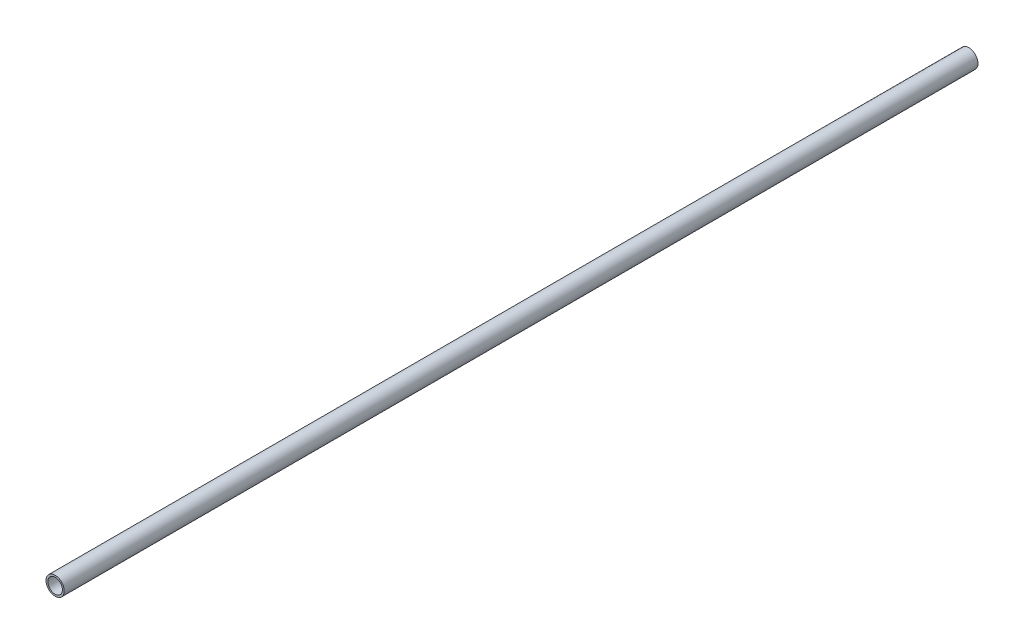
ISO-10303-21;
HEADER;
FILE_DESCRIPTION(('STEP AP214'),'2;1');
FILE_NAME('part.step','',(''),(''),'','','');
FILE_SCHEMA(('AUTOMOTIVE_DESIGN { 1 0 10303 214 1 1 1 1 }'));
ENDSEC;
DATA;
#1=APPLICATION_CONTEXT('core data for automotive mechanical design processes');
#2=APPLICATION_PROTOCOL_DEFINITION('international standard','automotive_design',2000,#1);
#3=PRODUCT_CONTEXT('',#1,'mechanical');
#4=PRODUCT('Part','Part','',(#3));
#5=PRODUCT_RELATED_PRODUCT_CATEGORY('part','',(#4));
#6=PRODUCT_DEFINITION_FORMATION('','',#4);
#7=PRODUCT_DEFINITION_CONTEXT('part definition',#1,'design');
#8=PRODUCT_DEFINITION('design','',#6,#7);
#9=PRODUCT_DEFINITION_SHAPE('','',#8);
#10=(LENGTH_UNIT() NAMED_UNIT(*) SI_UNIT(.MILLI.,.METRE.));
#11=(NAMED_UNIT(*) PLANE_ANGLE_UNIT() SI_UNIT($,.RADIAN.));
#12=(NAMED_UNIT(*) SI_UNIT($,.STERADIAN.) SOLID_ANGLE_UNIT());
#13=UNCERTAINTY_MEASURE_WITH_UNIT(LENGTH_MEASURE(1.E-05),#10,'distance_accuracy_value','');
#14=(GEOMETRIC_REPRESENTATION_CONTEXT(3) GLOBAL_UNCERTAINTY_ASSIGNED_CONTEXT((#13)) GLOBAL_UNIT_ASSIGNED_CONTEXT((#10,
#11,#12)) REPRESENTATION_CONTEXT('',''));
#15=CARTESIAN_POINT('',(0.,0.,0.));
#16=DIRECTION('',(0.,0.,1.));
#17=DIRECTION('',(1.,0.,0.));
#18=AXIS2_PLACEMENT_3D('',#15,#16,#17);
#19=CARTESIAN_POINT('',(0.,0.,1000.));
#20=DIRECTION('',(0.,0.,1.));
#21=DIRECTION('',(1.,0.,0.));
#22=AXIS2_PLACEMENT_3D('',#19,#20,#21);
#23=PLANE('',#22);
#24=CARTESIAN_POINT('',(0.,0.,1000.));
#25=DIRECTION('',(0.,0.,1.));
#26=DIRECTION('',(1.,0.,0.));
#27=AXIS2_PLACEMENT_3D('',#24,#25,#26);
#28=CIRCLE('',#27,10.);
#29=CARTESIAN_POINT('',(10.,0.,1000.));
#30=VERTEX_POINT('',#29);
#31=EDGE_CURVE('E10',#30,#30,#28,.T.);
#32=ORIENTED_EDGE('',*,*,#31,.T.);
#33=EDGE_LOOP('',(#32));
#34=FACE_BOUND('',#33,.T.);
#35=CARTESIAN_POINT('',(0.,0.,1000.));
#36=DIRECTION('',(0.,0.,1.));
#37=DIRECTION('',(1.,0.,0.));
#38=AXIS2_PLACEMENT_3D('',#35,#36,#37);
#39=CIRCLE('',#38,8.);
#40=CARTESIAN_POINT('',(8.,0.,1000.));
#41=VERTEX_POINT('',#40);
#42=EDGE_CURVE('E41',#41,#41,#39,.T.);
#43=ORIENTED_EDGE('',*,*,#42,.F.);
#44=EDGE_LOOP('',(#43));
#45=FACE_BOUND('',#44,.T.);
#46=ADVANCED_FACE('F30',(#34,#45),#23,.T.);
#47=CARTESIAN_POINT('',(0.,0.,0.));
#48=DIRECTION('',(0.,0.,1.));
#49=DIRECTION('',(1.,0.,0.));
#50=AXIS2_PLACEMENT_3D('',#47,#48,#49);
#51=PLANE('',#50);
#52=CARTESIAN_POINT('',(0.,0.,0.));
#53=DIRECTION('',(0.,0.,1.));
#54=DIRECTION('',(1.,0.,0.));
#55=AXIS2_PLACEMENT_3D('',#52,#53,#54);
#56=CIRCLE('',#55,10.);
#57=CARTESIAN_POINT('',(10.,0.,0.));
#58=VERTEX_POINT('',#57);
#59=EDGE_CURVE('E34',#58,#58,#56,.T.);
#60=ORIENTED_EDGE('',*,*,#59,.F.);
#61=EDGE_LOOP('',(#60));
#62=FACE_BOUND('',#61,.T.);
#63=CARTESIAN_POINT('',(0.,0.,0.));
#64=DIRECTION('',(0.,0.,1.));
#65=DIRECTION('',(1.,0.,0.));
#66=AXIS2_PLACEMENT_3D('',#63,#64,#65);
#67=CIRCLE('',#66,8.);
#68=CARTESIAN_POINT('',(8.,0.,0.));
#69=VERTEX_POINT('',#68);
#70=EDGE_CURVE('E43',#69,#69,#67,.T.);
#71=ORIENTED_EDGE('',*,*,#70,.T.);
#72=EDGE_LOOP('',(#71));
#73=FACE_BOUND('',#72,.T.);
#74=ADVANCED_FACE('F53',(#62,#73),#51,.F.);
#75=CARTESIAN_POINT('',(0.,0.,1000.));
#76=DIRECTION('',(0.,0.,-1.));
#77=DIRECTION('',(-1.,0.,0.));
#78=AXIS2_PLACEMENT_3D('',#75,#76,#77);
#79=CYLINDRICAL_SURFACE('',#78,10.);
#80=ORIENTED_EDGE('',*,*,#31,.F.);
#81=EDGE_LOOP('',(#80));
#82=FACE_BOUND('',#81,.T.);
#83=ORIENTED_EDGE('',*,*,#59,.T.);
#84=EDGE_LOOP('',(#83));
#85=FACE_BOUND('',#84,.T.);
#86=ADVANCED_FACE('F32',(#82,#85),#79,.T.);
#87=CARTESIAN_POINT('',(0.,0.,1000.));
#88=DIRECTION('',(0.,0.,-1.));
#89=DIRECTION('',(-1.,0.,0.));
#90=AXIS2_PLACEMENT_3D('',#87,#88,#89);
#91=CYLINDRICAL_SURFACE('',#90,8.);
#92=ORIENTED_EDGE('',*,*,#42,.T.);
#93=EDGE_LOOP('',(#92));
#94=FACE_BOUND('',#93,.T.);
#95=ORIENTED_EDGE('',*,*,#70,.F.);
#96=EDGE_LOOP('',(#95));
#97=FACE_BOUND('',#96,.T.);
#98=ADVANCED_FACE('F49',(#94,#97),#91,.F.);
#99=CLOSED_SHELL('',(#46,#74,#86,#98));
#100=MANIFOLD_SOLID_BREP('B2',#99);
#101=ADVANCED_BREP_SHAPE_REPRESENTATION('',(#18,#100),#14);
#102=SHAPE_DEFINITION_REPRESENTATION(#9,#101);
ENDSEC;
END-ISO-10303-21;
